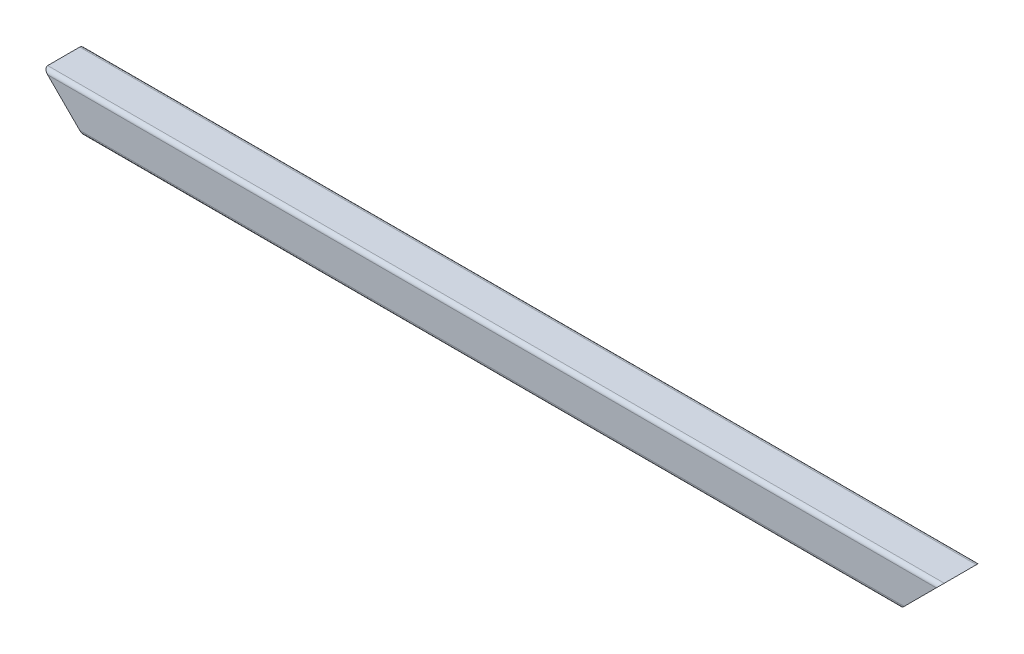
ISO-10303-21;
HEADER;
FILE_DESCRIPTION(('STEP AP214'),'2;1');
FILE_NAME('part.step','',(''),(''),'','','');
FILE_SCHEMA(('AUTOMOTIVE_DESIGN { 1 0 10303 214 1 1 1 1 }'));
ENDSEC;
DATA;
#1=APPLICATION_CONTEXT('core data for automotive mechanical design processes');
#2=APPLICATION_PROTOCOL_DEFINITION('international standard','automotive_design',2000,#1);
#3=PRODUCT_CONTEXT('',#1,'mechanical');
#4=PRODUCT('Part','Part','',(#3));
#5=PRODUCT_RELATED_PRODUCT_CATEGORY('part','',(#4));
#6=PRODUCT_DEFINITION_FORMATION('','',#4);
#7=PRODUCT_DEFINITION_CONTEXT('part definition',#1,'design');
#8=PRODUCT_DEFINITION('design','',#6,#7);
#9=PRODUCT_DEFINITION_SHAPE('','',#8);
#10=(LENGTH_UNIT() NAMED_UNIT(*) SI_UNIT(.MILLI.,.METRE.));
#11=(NAMED_UNIT(*) PLANE_ANGLE_UNIT() SI_UNIT($,.RADIAN.));
#12=(NAMED_UNIT(*) SI_UNIT($,.STERADIAN.) SOLID_ANGLE_UNIT());
#13=UNCERTAINTY_MEASURE_WITH_UNIT(LENGTH_MEASURE(1.E-05),#10,'distance_accuracy_value','');
#14=(GEOMETRIC_REPRESENTATION_CONTEXT(3) GLOBAL_UNCERTAINTY_ASSIGNED_CONTEXT((#13)) GLOBAL_UNIT_ASSIGNED_CONTEXT((#10,
#11,#12)) REPRESENTATION_CONTEXT('',''));
#15=CARTESIAN_POINT('',(0.,0.,0.));
#16=DIRECTION('',(0.,0.,1.));
#17=DIRECTION('',(1.,0.,0.));
#18=AXIS2_PLACEMENT_3D('',#15,#16,#17);
#19=CARTESIAN_POINT('',(-271.504604576393,354.839036719435,-774.69372114316));
#20=DIRECTION('',(0.,0.,1.));
#21=DIRECTION('',(1.,0.,0.));
#22=AXIS2_PLACEMENT_3D('',#19,#20,#21);
#23=PLANE('',#22);
#24=DIRECTION('',(-0.707106781186547,-0.707106781186548,0.));
#25=VECTOR('',#24,1.);
#26=CARTESIAN_POINT('',(-5.72769999999995,89.0621321430426,-774.69372114316));
#27=LINE('',#26,#25);
#28=CARTESIAN_POINT('',(282.960004576393,377.749836719435,-774.69372114316));
#29=VERTEX_POINT('',#28);
#30=CARTESIAN_POINT('',(260.049204576393,354.839036719435,-774.69372114316));
#31=VERTEX_POINT('',#30);
#32=EDGE_CURVE('E194',#29,#31,#27,.T.);
#33=ORIENTED_EDGE('',*,*,#32,.F.);
#34=DIRECTION('',(1.,0.,0.));
#35=VECTOR('',#34,1.);
#36=CARTESIAN_POINT('',(-271.504604576393,377.749836719435,-774.69372114316));
#37=LINE('',#36,#35);
#38=CARTESIAN_POINT('',(-282.960004576393,377.749836719435,-774.69372114316));
#39=VERTEX_POINT('',#38);
#40=EDGE_CURVE('E183',#39,#29,#37,.T.);
#41=ORIENTED_EDGE('',*,*,#40,.F.);
#42=DIRECTION('',(-0.707106781186547,0.707106781186548,0.));
#43=VECTOR('',#42,1.);
#44=CARTESIAN_POINT('',(-265.776904576393,360.566736719435,-774.69372114316));
#45=LINE('',#44,#43);
#46=CARTESIAN_POINT('',(-260.049204576393,354.839036719435,-774.69372114316));
#47=VERTEX_POINT('',#46);
#48=EDGE_CURVE('E175',#47,#39,#45,.T.);
#49=ORIENTED_EDGE('',*,*,#48,.F.);
#50=DIRECTION('',(1.,0.,0.));
#51=VECTOR('',#50,1.);
#52=CARTESIAN_POINT('',(-271.504604576393,354.839036719435,-774.69372114316));
#53=LINE('',#52,#51);
#54=EDGE_CURVE('E155',#47,#31,#53,.T.);
#55=ORIENTED_EDGE('',*,*,#54,.T.);
#56=EDGE_LOOP('',(#33,#41,#49,#55));
#57=FACE_BOUND('',#56,.T.);
#58=ADVANCED_FACE('F43',(#57),#23,.T.);
#59=CARTESIAN_POINT('',(-271.504604576393,377.749836719435,-751.78292114316));
#60=DIRECTION('',(0.,-1.,0.));
#61=DIRECTION('',(0.,0.,-1.));
#62=AXIS2_PLACEMENT_3D('',#59,#60,#61);
#63=PLANE('',#62);
#64=DIRECTION('',(0.,0.,-1.));
#65=VECTOR('',#64,1.);
#66=CARTESIAN_POINT('',(282.960004576393,377.749836719435,-751.78292114316));
#67=LINE('',#66,#65);
#68=CARTESIAN_POINT('',(282.960004576393,377.749836719435,-751.78292114316));
#69=VERTEX_POINT('',#68);
#70=EDGE_CURVE('E166',#69,#29,#67,.T.);
#71=ORIENTED_EDGE('',*,*,#70,.F.);
#72=DIRECTION('',(1.,0.,0.));
#73=VECTOR('',#72,1.);
#74=CARTESIAN_POINT('',(-271.504604576393,377.749836719435,-751.78292114316));
#75=LINE('',#74,#73);
#76=CARTESIAN_POINT('',(-282.960004576393,377.749836719435,-751.78292114316));
#77=VERTEX_POINT('',#76);
#78=EDGE_CURVE('E154',#77,#69,#75,.T.);
#79=ORIENTED_EDGE('',*,*,#78,.F.);
#80=DIRECTION('',(0.,0.,1.));
#81=VECTOR('',#80,1.);
#82=CARTESIAN_POINT('',(-282.960004576393,377.749836719435,-751.78292114316));
#83=LINE('',#82,#81);
#84=EDGE_CURVE('E139',#39,#77,#83,.T.);
#85=ORIENTED_EDGE('',*,*,#84,.F.);
#86=ORIENTED_EDGE('',*,*,#40,.T.);
#87=EDGE_LOOP('',(#71,#79,#85,#86));
#88=FACE_BOUND('',#87,.T.);
#89=ADVANCED_FACE('F308',(#88),#63,.T.);
#90=CARTESIAN_POINT('',(-271.504604576393,354.839036719435,-751.78292114316));
#91=DIRECTION('',(0.,0.,-1.));
#92=DIRECTION('',(-1.,0.,0.));
#93=AXIS2_PLACEMENT_3D('',#90,#91,#92);
#94=PLANE('',#93);
#95=DIRECTION('',(0.707106781186547,0.707106781186548,0.));
#96=VECTOR('',#95,1.);
#97=CARTESIAN_POINT('',(-5.72769999999995,89.0621321430426,-751.78292114316));
#98=LINE('',#97,#96);
#99=CARTESIAN_POINT('',(260.049204576393,354.839036719435,-751.78292114316));
#100=VERTEX_POINT('',#99);
#101=EDGE_CURVE('E150',#100,#69,#98,.T.);
#102=ORIENTED_EDGE('',*,*,#101,.F.);
#103=DIRECTION('',(1.,0.,0.));
#104=VECTOR('',#103,1.);
#105=CARTESIAN_POINT('',(-271.504604576393,354.839036719435,-751.78292114316));
#106=LINE('',#105,#104);
#107=CARTESIAN_POINT('',(-260.049204576393,354.839036719435,-751.78292114316));
#108=VERTEX_POINT('',#107);
#109=EDGE_CURVE('E148',#108,#100,#106,.T.);
#110=ORIENTED_EDGE('',*,*,#109,.F.);
#111=DIRECTION('',(0.707106781186547,-0.707106781186548,0.));
#112=VECTOR('',#111,1.);
#113=CARTESIAN_POINT('',(-265.776904576393,360.566736719435,-751.78292114316));
#114=LINE('',#113,#112);
#115=EDGE_CURVE('E132',#77,#108,#114,.T.);
#116=ORIENTED_EDGE('',*,*,#115,.F.);
#117=ORIENTED_EDGE('',*,*,#78,.T.);
#118=EDGE_LOOP('',(#102,#110,#116,#117));
#119=FACE_BOUND('',#118,.T.);
#120=ADVANCED_FACE('F149',(#119),#94,.T.);
#121=CARTESIAN_POINT('',(-271.504604576393,354.839036719435,-751.78292114316));
#122=DIRECTION('',(0.,1.,0.));
#123=DIRECTION('',(0.,0.,1.));
#124=AXIS2_PLACEMENT_3D('',#121,#122,#123);
#125=PLANE('',#124);
#126=DIRECTION('',(0.,0.,1.));
#127=VECTOR('',#126,1.);
#128=CARTESIAN_POINT('',(260.049204576393,354.839036719435,-751.78292114316));
#129=LINE('',#128,#127);
#130=EDGE_CURVE('E264',#31,#100,#129,.T.);
#131=ORIENTED_EDGE('',*,*,#130,.F.);
#132=ORIENTED_EDGE('',*,*,#54,.F.);
#133=DIRECTION('',(0.,0.,-1.));
#134=VECTOR('',#133,1.);
#135=CARTESIAN_POINT('',(-260.049204576393,354.839036719435,-751.78292114316));
#136=LINE('',#135,#134);
#137=EDGE_CURVE('E136',#108,#47,#136,.T.);
#138=ORIENTED_EDGE('',*,*,#137,.F.);
#139=ORIENTED_EDGE('',*,*,#109,.T.);
#140=EDGE_LOOP('',(#131,#132,#138,#139));
#141=FACE_BOUND('',#140,.T.);
#142=ADVANCED_FACE('F158',(#141),#125,.T.);
#143=CARTESIAN_POINT('',(-271.504604576393,366.294436719435,-763.238321143161));
#144=DIRECTION('',(0.707106781186548,0.707106781186547,0.));
#145=DIRECTION('',(-0.707106781186547,0.707106781186548,0.));
#146=AXIS2_PLACEMENT_3D('',#143,#144,#145);
#147=PLANE('',#146);
#148=ORIENTED_EDGE('',*,*,#48,.T.);
#149=ORIENTED_EDGE('',*,*,#84,.T.);
#150=ORIENTED_EDGE('',*,*,#115,.T.);
#151=ORIENTED_EDGE('',*,*,#137,.T.);
#152=EDGE_LOOP('',(#148,#149,#150,#151));
#153=FACE_BOUND('',#152,.T.);
#154=DIRECTION('',(0.707106781186547,-0.707106781186548,0.));
#155=VECTOR('',#154,1.);
#156=CARTESIAN_POINT('',(-265.154604576393,359.944436719435,-750.53832114316));
#157=LINE('',#156,#155);
#158=CARTESIAN_POINT('',(-281.664604576393,376.454436719435,-750.53832114316));
#159=VERTEX_POINT('',#158);
#160=CARTESIAN_POINT('',(-261.344604576393,356.134436719435,-750.53832114316));
#161=VERTEX_POINT('',#160);
#162=EDGE_CURVE('E178',#159,#161,#157,.T.);
#163=ORIENTED_EDGE('',*,*,#162,.F.);
#164=CARTESIAN_POINT('',(-281.664604576393,376.454436719435,-753.07832114316));
#165=DIRECTION('',(0.707106781186548,0.707106781186547,0.));
#166=DIRECTION('',(0.707106781186547,-0.707106781186548,0.));
#167=AXIS2_PLACEMENT_3D('',#164,#165,#166);
#168=ELLIPSE('',#167,3.59210244842766,2.54);
#169=CARTESIAN_POINT('',(-284.204604576393,378.994436719435,-753.07832114316));
#170=VERTEX_POINT('',#169);
#171=EDGE_CURVE('E225',#159,#170,#168,.F.);
#172=ORIENTED_EDGE('',*,*,#171,.T.);
#173=DIRECTION('',(0.,0.,1.));
#174=VECTOR('',#173,1.);
#175=CARTESIAN_POINT('',(-284.204604576393,378.994436719435,-750.53832114316));
#176=LINE('',#175,#174);
#177=CARTESIAN_POINT('',(-284.204604576393,378.994436719435,-773.398321143161));
#178=VERTEX_POINT('',#177);
#179=EDGE_CURVE('E144',#178,#170,#176,.T.);
#180=ORIENTED_EDGE('',*,*,#179,.F.);
#181=CARTESIAN_POINT('',(-281.664604576393,376.454436719435,-773.398321143161));
#182=DIRECTION('',(0.707106781186548,0.707106781186547,0.));
#183=DIRECTION('',(0.707106781186547,-0.707106781186548,0.));
#184=AXIS2_PLACEMENT_3D('',#181,#182,#183);
#185=ELLIPSE('',#184,3.59210244842766,2.54);
#186=CARTESIAN_POINT('',(-281.664604576393,376.454436719435,-775.938321143161));
#187=VERTEX_POINT('',#186);
#188=EDGE_CURVE('E59',#178,#187,#185,.F.);
#189=ORIENTED_EDGE('',*,*,#188,.T.);
#190=DIRECTION('',(-0.707106781186547,0.707106781186548,0.));
#191=VECTOR('',#190,1.);
#192=CARTESIAN_POINT('',(-265.154604576393,359.944436719435,-775.938321143161));
#193=LINE('',#192,#191);
#194=CARTESIAN_POINT('',(-261.344604576393,356.134436719435,-775.938321143161));
#195=VERTEX_POINT('',#194);
#196=EDGE_CURVE('E162',#195,#187,#193,.T.);
#197=ORIENTED_EDGE('',*,*,#196,.F.);
#198=CARTESIAN_POINT('',(-261.344604576393,356.134436719435,-773.398321143161));
#199=DIRECTION('',(0.707106781186548,0.707106781186547,0.));
#200=DIRECTION('',(0.707106781186547,-0.707106781186548,0.));
#201=AXIS2_PLACEMENT_3D('',#198,#199,#200);
#202=ELLIPSE('',#201,3.59210244842766,2.54);
#203=CARTESIAN_POINT('',(-258.804604576393,353.594436719435,-773.398321143161));
#204=VERTEX_POINT('',#203);
#205=EDGE_CURVE('E219',#195,#204,#202,.F.);
#206=ORIENTED_EDGE('',*,*,#205,.T.);
#207=DIRECTION('',(0.,0.,-1.));
#208=VECTOR('',#207,1.);
#209=CARTESIAN_POINT('',(-258.804604576393,353.594436719435,-750.53832114316));
#210=LINE('',#209,#208);
#211=CARTESIAN_POINT('',(-258.804604576393,353.594436719435,-753.07832114316));
#212=VERTEX_POINT('',#211);
#213=EDGE_CURVE('E169',#212,#204,#210,.T.);
#214=ORIENTED_EDGE('',*,*,#213,.F.);
#215=CARTESIAN_POINT('',(-261.344604576393,356.134436719435,-753.07832114316));
#216=DIRECTION('',(0.707106781186548,0.707106781186547,0.));
#217=DIRECTION('',(0.707106781186547,-0.707106781186548,0.));
#218=AXIS2_PLACEMENT_3D('',#215,#216,#217);
#219=ELLIPSE('',#218,3.59210244842766,2.54);
#220=EDGE_CURVE('E222',#212,#161,#219,.F.);
#221=ORIENTED_EDGE('',*,*,#220,.T.);
#222=EDGE_LOOP('',(#163,#172,#180,#189,#197,#206,#214,#221));
#223=FACE_BOUND('',#222,.T.);
#224=ADVANCED_FACE('F134',(#153,#223),#147,.F.);
#225=CARTESIAN_POINT('',(-271.504604576393,353.594436719435,-775.938321143161));
#226=DIRECTION('',(0.,0.,1.));
#227=DIRECTION('',(1.,0.,0.));
#228=AXIS2_PLACEMENT_3D('',#225,#226,#227);
#229=PLANE('',#228);
#230=DIRECTION('',(-0.707106781186547,-0.707106781186548,0.));
#231=VECTOR('',#230,1.);
#232=CARTESIAN_POINT('',(-6.34999999999991,88.4398321430426,-775.938321143161));
#233=LINE('',#232,#231);
#234=CARTESIAN_POINT('',(281.664604576393,376.454436719435,-775.938321143161));
#235=VERTEX_POINT('',#234);
#236=CARTESIAN_POINT('',(261.344604576393,356.134436719435,-775.938321143161));
#237=VERTEX_POINT('',#236);
#238=EDGE_CURVE('E161',#235,#237,#233,.T.);
#239=ORIENTED_EDGE('',*,*,#238,.T.);
#240=DIRECTION('',(1.,0.,0.));
#241=VECTOR('',#240,1.);
#242=CARTESIAN_POINT('',(-271.504604576393,356.134436719435,-775.938321143161));
#243=LINE('',#242,#241);
#244=EDGE_CURVE('E11',#237,#195,#243,.F.);
#245=ORIENTED_EDGE('',*,*,#244,.T.);
#246=ORIENTED_EDGE('',*,*,#196,.T.);
#247=DIRECTION('',(1.,0.,0.));
#248=VECTOR('',#247,1.);
#249=CARTESIAN_POINT('',(-271.504604576393,376.454436719435,-775.938321143161));
#250=LINE('',#249,#248);
#251=EDGE_CURVE('E52',#187,#235,#250,.T.);
#252=ORIENTED_EDGE('',*,*,#251,.T.);
#253=EDGE_LOOP('',(#239,#245,#246,#252));
#254=FACE_BOUND('',#253,.T.);
#255=ADVANCED_FACE('F240',(#254),#229,.F.);
#256=CARTESIAN_POINT('',(-271.504604576393,353.594436719435,-750.53832114316));
#257=DIRECTION('',(0.,1.,0.));
#258=DIRECTION('',(0.,0.,1.));
#259=AXIS2_PLACEMENT_3D('',#256,#257,#258);
#260=PLANE('',#259);
#261=DIRECTION('',(0.,0.,1.));
#262=VECTOR('',#261,1.);
#263=CARTESIAN_POINT('',(258.804604576393,353.594436719435,-750.53832114316));
#264=LINE('',#263,#262);
#265=CARTESIAN_POINT('',(258.804604576393,353.594436719435,-773.398321143161));
#266=VERTEX_POINT('',#265);
#267=CARTESIAN_POINT('',(258.804604576393,353.594436719435,-753.07832114316));
#268=VERTEX_POINT('',#267);
#269=EDGE_CURVE('E248',#266,#268,#264,.T.);
#270=ORIENTED_EDGE('',*,*,#269,.T.);
#271=DIRECTION('',(1.,0.,0.));
#272=VECTOR('',#271,1.);
#273=CARTESIAN_POINT('',(-271.504604576393,353.594436719435,-753.07832114316));
#274=LINE('',#273,#272);
#275=EDGE_CURVE('E232',#268,#212,#274,.F.);
#276=ORIENTED_EDGE('',*,*,#275,.T.);
#277=ORIENTED_EDGE('',*,*,#213,.T.);
#278=DIRECTION('',(1.,0.,0.));
#279=VECTOR('',#278,1.);
#280=CARTESIAN_POINT('',(-271.504604576393,353.594436719435,-773.398321143161));
#281=LINE('',#280,#279);
#282=EDGE_CURVE('E228',#204,#266,#281,.T.);
#283=ORIENTED_EDGE('',*,*,#282,.T.);
#284=EDGE_LOOP('',(#270,#276,#277,#283));
#285=FACE_BOUND('',#284,.T.);
#286=ADVANCED_FACE('F255',(#285),#260,.F.);
#287=CARTESIAN_POINT('',(-271.504604576393,353.594436719435,-750.53832114316));
#288=DIRECTION('',(0.,0.,-1.));
#289=DIRECTION('',(-1.,0.,0.));
#290=AXIS2_PLACEMENT_3D('',#287,#288,#289);
#291=PLANE('',#290);
#292=DIRECTION('',(0.707106781186547,0.707106781186548,0.));
#293=VECTOR('',#292,1.);
#294=CARTESIAN_POINT('',(-6.34999999999991,88.4398321430426,-750.53832114316));
#295=LINE('',#294,#293);
#296=CARTESIAN_POINT('',(261.344604576393,356.134436719435,-750.53832114316));
#297=VERTEX_POINT('',#296);
#298=CARTESIAN_POINT('',(281.664604576393,376.454436719435,-750.53832114316));
#299=VERTEX_POINT('',#298);
#300=EDGE_CURVE('E276',#297,#299,#295,.T.);
#301=ORIENTED_EDGE('',*,*,#300,.T.);
#302=DIRECTION('',(1.,0.,0.));
#303=VECTOR('',#302,1.);
#304=CARTESIAN_POINT('',(-271.504604576393,376.454436719435,-750.53832114316));
#305=LINE('',#304,#303);
#306=EDGE_CURVE('E214',#299,#159,#305,.F.);
#307=ORIENTED_EDGE('',*,*,#306,.T.);
#308=ORIENTED_EDGE('',*,*,#162,.T.);
#309=DIRECTION('',(1.,0.,0.));
#310=VECTOR('',#309,1.);
#311=CARTESIAN_POINT('',(-271.504604576393,356.134436719435,-750.53832114316));
#312=LINE('',#311,#310);
#313=EDGE_CURVE('E210',#161,#297,#312,.T.);
#314=ORIENTED_EDGE('',*,*,#313,.T.);
#315=EDGE_LOOP('',(#301,#307,#308,#314));
#316=FACE_BOUND('',#315,.T.);
#317=ADVANCED_FACE('F292',(#316),#291,.F.);
#318=CARTESIAN_POINT('',(-271.504604576393,378.994436719435,-750.53832114316));
#319=DIRECTION('',(0.,-1.,0.));
#320=DIRECTION('',(0.,0.,-1.));
#321=AXIS2_PLACEMENT_3D('',#318,#319,#320);
#322=PLANE('',#321);
#323=ORIENTED_EDGE('',*,*,#179,.T.);
#324=DIRECTION('',(1.,0.,0.));
#325=VECTOR('',#324,1.);
#326=CARTESIAN_POINT('',(-271.504604576393,378.994436719435,-753.07832114316));
#327=LINE('',#326,#325);
#328=CARTESIAN_POINT('',(284.204604576393,378.994436719435,-753.07832114316));
#329=VERTEX_POINT('',#328);
#330=EDGE_CURVE('E193',#170,#329,#327,.T.);
#331=ORIENTED_EDGE('',*,*,#330,.T.);
#332=DIRECTION('',(0.,0.,-1.));
#333=VECTOR('',#332,1.);
#334=CARTESIAN_POINT('',(284.204604576393,378.994436719435,-750.53832114316));
#335=LINE('',#334,#333);
#336=CARTESIAN_POINT('',(284.204604576393,378.994436719435,-773.398321143161));
#337=VERTEX_POINT('',#336);
#338=EDGE_CURVE('E273',#329,#337,#335,.T.);
#339=ORIENTED_EDGE('',*,*,#338,.T.);
#340=DIRECTION('',(1.,0.,0.));
#341=VECTOR('',#340,1.);
#342=CARTESIAN_POINT('',(-271.504604576393,378.994436719435,-773.398321143161));
#343=LINE('',#342,#341);
#344=EDGE_CURVE('E190',#337,#178,#343,.F.);
#345=ORIENTED_EDGE('',*,*,#344,.T.);
#346=EDGE_LOOP('',(#323,#331,#339,#345));
#347=FACE_BOUND('',#346,.T.);
#348=ADVANCED_FACE('F300',(#347),#322,.F.);
#349=CARTESIAN_POINT('',(271.504604576393,366.294436719435,-763.238321143161));
#350=DIRECTION('',(-0.707106781186548,0.707106781186547,0.));
#351=DIRECTION('',(-0.707106781186547,-0.707106781186548,0.));
#352=AXIS2_PLACEMENT_3D('',#349,#350,#351);
#353=PLANE('',#352);
#354=ORIENTED_EDGE('',*,*,#130,.T.);
#355=ORIENTED_EDGE('',*,*,#101,.T.);
#356=ORIENTED_EDGE('',*,*,#70,.T.);
#357=ORIENTED_EDGE('',*,*,#32,.T.);
#358=EDGE_LOOP('',(#354,#355,#356,#357));
#359=FACE_BOUND('',#358,.T.);
#360=ORIENTED_EDGE('',*,*,#338,.F.);
#361=CARTESIAN_POINT('',(281.664604576393,376.454436719435,-753.07832114316));
#362=DIRECTION('',(-0.707106781186548,0.707106781186547,0.));
#363=DIRECTION('',(0.707106781186547,0.707106781186548,0.));
#364=AXIS2_PLACEMENT_3D('',#361,#362,#363);
#365=ELLIPSE('',#364,3.59210244842766,2.54);
#366=EDGE_CURVE('E207',#329,#299,#365,.F.);
#367=ORIENTED_EDGE('',*,*,#366,.T.);
#368=ORIENTED_EDGE('',*,*,#300,.F.);
#369=CARTESIAN_POINT('',(261.344604576393,356.134436719435,-753.07832114316));
#370=DIRECTION('',(-0.707106781186548,0.707106781186547,0.));
#371=DIRECTION('',(0.707106781186547,0.707106781186548,0.));
#372=AXIS2_PLACEMENT_3D('',#369,#370,#371);
#373=ELLIPSE('',#372,3.59210244842766,2.54);
#374=EDGE_CURVE('E204',#297,#268,#373,.F.);
#375=ORIENTED_EDGE('',*,*,#374,.T.);
#376=ORIENTED_EDGE('',*,*,#269,.F.);
#377=CARTESIAN_POINT('',(261.344604576393,356.134436719435,-773.398321143161));
#378=DIRECTION('',(-0.707106781186548,0.707106781186547,0.));
#379=DIRECTION('',(0.707106781186547,0.707106781186548,0.));
#380=AXIS2_PLACEMENT_3D('',#377,#378,#379);
#381=ELLIPSE('',#380,3.59210244842766,2.54);
#382=EDGE_CURVE('E201',#266,#237,#381,.F.);
#383=ORIENTED_EDGE('',*,*,#382,.T.);
#384=ORIENTED_EDGE('',*,*,#238,.F.);
#385=CARTESIAN_POINT('',(281.664604576393,376.454436719435,-773.398321143161));
#386=DIRECTION('',(-0.707106781186548,0.707106781186547,0.));
#387=DIRECTION('',(0.707106781186547,0.707106781186548,0.));
#388=AXIS2_PLACEMENT_3D('',#385,#386,#387);
#389=ELLIPSE('',#388,3.59210244842766,2.54);
#390=EDGE_CURVE('E198',#235,#337,#389,.F.);
#391=ORIENTED_EDGE('',*,*,#390,.T.);
#392=EDGE_LOOP('',(#360,#367,#368,#375,#376,#383,#384,#391));
#393=FACE_BOUND('',#392,.T.);
#394=ADVANCED_FACE('F244',(#359,#393),#353,.F.);
#395=CARTESIAN_POINT('',(-271.504604576393,376.454436719435,-753.07832114316));
#396=DIRECTION('',(1.,0.,0.));
#397=DIRECTION('',(0.,0.,-1.));
#398=AXIS2_PLACEMENT_3D('',#395,#396,#397);
#399=CYLINDRICAL_SURFACE('',#398,2.54);
#400=ORIENTED_EDGE('',*,*,#171,.F.);
#401=ORIENTED_EDGE('',*,*,#306,.F.);
#402=ORIENTED_EDGE('',*,*,#366,.F.);
#403=ORIENTED_EDGE('',*,*,#330,.F.);
#404=EDGE_LOOP('',(#400,#401,#402,#403));
#405=FACE_BOUND('',#404,.T.);
#406=ADVANCED_FACE('F297',(#405),#399,.T.);
#407=CARTESIAN_POINT('',(-271.504604576393,356.134436719435,-753.07832114316));
#408=DIRECTION('',(1.,0.,0.));
#409=DIRECTION('',(0.,0.,-1.));
#410=AXIS2_PLACEMENT_3D('',#407,#408,#409);
#411=CYLINDRICAL_SURFACE('',#410,2.54);
#412=ORIENTED_EDGE('',*,*,#220,.F.);
#413=ORIENTED_EDGE('',*,*,#275,.F.);
#414=ORIENTED_EDGE('',*,*,#374,.F.);
#415=ORIENTED_EDGE('',*,*,#313,.F.);
#416=EDGE_LOOP('',(#412,#413,#414,#415));
#417=FACE_BOUND('',#416,.T.);
#418=ADVANCED_FACE('F306',(#417),#411,.T.);
#419=CARTESIAN_POINT('',(-271.504604576393,356.134436719435,-773.398321143161));
#420=DIRECTION('',(1.,0.,0.));
#421=DIRECTION('',(0.,0.,-1.));
#422=AXIS2_PLACEMENT_3D('',#419,#420,#421);
#423=CYLINDRICAL_SURFACE('',#422,2.54);
#424=ORIENTED_EDGE('',*,*,#205,.F.);
#425=ORIENTED_EDGE('',*,*,#244,.F.);
#426=ORIENTED_EDGE('',*,*,#382,.F.);
#427=ORIENTED_EDGE('',*,*,#282,.F.);
#428=EDGE_LOOP('',(#424,#425,#426,#427));
#429=FACE_BOUND('',#428,.T.);
#430=ADVANCED_FACE('F252',(#429),#423,.T.);
#431=CARTESIAN_POINT('',(-271.504604576393,376.454436719435,-773.398321143161));
#432=DIRECTION('',(1.,0.,0.));
#433=DIRECTION('',(0.,0.,-1.));
#434=AXIS2_PLACEMENT_3D('',#431,#432,#433);
#435=CYLINDRICAL_SURFACE('',#434,2.54);
#436=ORIENTED_EDGE('',*,*,#188,.F.);
#437=ORIENTED_EDGE('',*,*,#344,.F.);
#438=ORIENTED_EDGE('',*,*,#390,.F.);
#439=ORIENTED_EDGE('',*,*,#251,.F.);
#440=EDGE_LOOP('',(#436,#437,#438,#439));
#441=FACE_BOUND('',#440,.T.);
#442=ADVANCED_FACE('F45',(#441),#435,.T.);
#443=CLOSED_SHELL('',(#58,#89,#120,#142,#224,#255,#286,#317,#348,#394,#406,#418,#430,#442));
#444=MANIFOLD_SOLID_BREP('B2',#443);
#445=ADVANCED_BREP_SHAPE_REPRESENTATION('',(#18,#444),#14);
#446=SHAPE_DEFINITION_REPRESENTATION(#9,#445);
ENDSEC;
END-ISO-10303-21;
